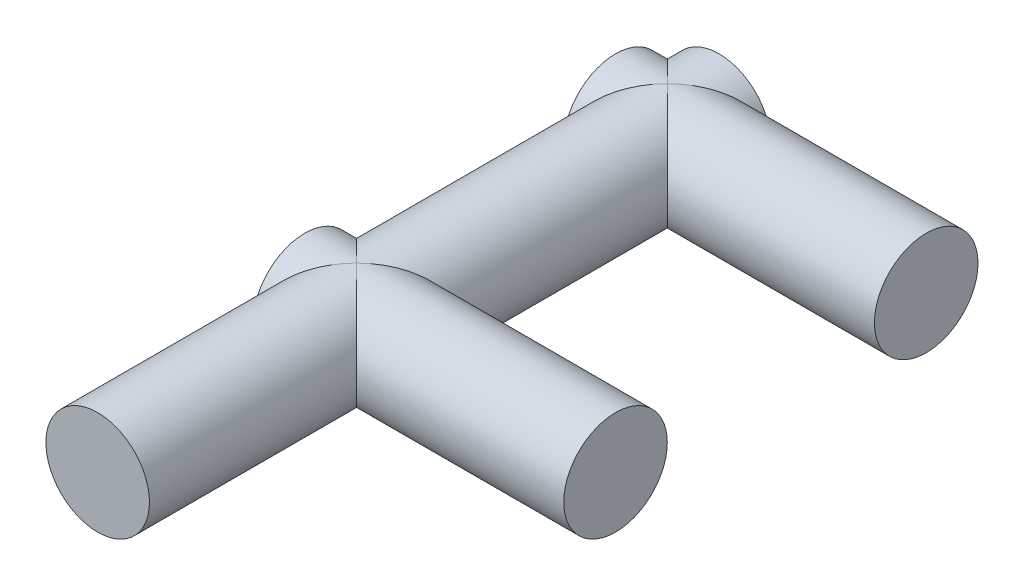
ISO-10303-21;
HEADER;
FILE_DESCRIPTION(('STEP AP214'),'2;1');
FILE_NAME('part.step','',(''),(''),'','','');
FILE_SCHEMA(('AUTOMOTIVE_DESIGN { 1 0 10303 214 1 1 1 1 }'));
ENDSEC;
DATA;
#1=APPLICATION_CONTEXT('core data for automotive mechanical design processes');
#2=APPLICATION_PROTOCOL_DEFINITION('international standard','automotive_design',2000,#1);
#3=PRODUCT_CONTEXT('',#1,'mechanical');
#4=PRODUCT('Part','Part','',(#3));
#5=PRODUCT_RELATED_PRODUCT_CATEGORY('part','',(#4));
#6=PRODUCT_DEFINITION_FORMATION('','',#4);
#7=PRODUCT_DEFINITION_CONTEXT('part definition',#1,'design');
#8=PRODUCT_DEFINITION('design','',#6,#7);
#9=PRODUCT_DEFINITION_SHAPE('','',#8);
#10=(LENGTH_UNIT() NAMED_UNIT(*) SI_UNIT(.MILLI.,.METRE.));
#11=(NAMED_UNIT(*) PLANE_ANGLE_UNIT() SI_UNIT($,.RADIAN.));
#12=(NAMED_UNIT(*) SI_UNIT($,.STERADIAN.) SOLID_ANGLE_UNIT());
#13=UNCERTAINTY_MEASURE_WITH_UNIT(LENGTH_MEASURE(1.E-05),#10,'distance_accuracy_value','');
#14=(GEOMETRIC_REPRESENTATION_CONTEXT(3) GLOBAL_UNCERTAINTY_ASSIGNED_CONTEXT((#13)) GLOBAL_UNIT_ASSIGNED_CONTEXT((#10,
#11,#12)) REPRESENTATION_CONTEXT('',''));
#15=CARTESIAN_POINT('',(0.,0.,0.));
#16=DIRECTION('',(0.,0.,1.));
#17=DIRECTION('',(1.,0.,0.));
#18=AXIS2_PLACEMENT_3D('',#15,#16,#17);
#19=CARTESIAN_POINT('',(0.396875,0.,-1.5875));
#20=DIRECTION('',(0.,0.,1.));
#21=DIRECTION('',(1.,0.,0.));
#22=AXIS2_PLACEMENT_3D('',#19,#20,#21);
#23=CYLINDRICAL_SURFACE('',#22,0.396875);
#24=CARTESIAN_POINT('',(0.396875,0.,1.190625));
#25=DIRECTION('',(-0.707106781186547,0.,-0.707106781186547));
#26=DIRECTION('',(-0.707106781186547,0.,0.707106781186547));
#27=AXIS2_PLACEMENT_3D('',#24,#25,#26);
#28=ELLIPSE('',#27,0.561266007566822,0.396875);
#29=CARTESIAN_POINT('',(0.396875,-0.396875,1.190625));
#30=VERTEX_POINT('',#29);
#31=CARTESIAN_POINT('',(0.396875,0.396875,1.190625));
#32=VERTEX_POINT('',#31);
#33=EDGE_CURVE('E64',#30,#32,#28,.F.);
#34=ORIENTED_EDGE('',*,*,#33,.F.);
#35=CARTESIAN_POINT('',(0.396875,0.,1.190625));
#36=DIRECTION('',(-0.707106781186547,0.,0.707106781186547));
#37=DIRECTION('',(-0.707106781186547,0.,-0.707106781186547));
#38=AXIS2_PLACEMENT_3D('',#35,#36,#37);
#39=ELLIPSE('',#38,0.561266007566822,0.396875);
#40=CARTESIAN_POINT('',(0.,0.,0.79375));
#41=VERTEX_POINT('',#40);
#42=EDGE_CURVE('E129',#41,#30,#39,.T.);
#43=ORIENTED_EDGE('',*,*,#42,.F.);
#44=EDGE_CURVE('E137',#32,#41,#39,.T.);
#45=ORIENTED_EDGE('',*,*,#44,.F.);
#46=EDGE_LOOP('',(#34,#43,#45));
#47=FACE_BOUND('',#46,.T.);
#48=CARTESIAN_POINT('',(0.396875,0.,-1.190625));
#49=DIRECTION('',(-0.707106781186547,0.,0.707106781186547));
#50=DIRECTION('',(0.707106781186547,0.,0.707106781186547));
#51=AXIS2_PLACEMENT_3D('',#48,#49,#50);
#52=ELLIPSE('',#51,0.561266007566822,0.396875);
#53=CARTESIAN_POINT('',(0.396875,-0.396875,-1.190625));
#54=VERTEX_POINT('',#53);
#55=CARTESIAN_POINT('',(0.396875,0.396875,-1.190625));
#56=VERTEX_POINT('',#55);
#57=EDGE_CURVE('E100',#54,#56,#52,.T.);
#58=ORIENTED_EDGE('',*,*,#57,.T.);
#59=CARTESIAN_POINT('',(0.396875,0.,-1.190625));
#60=DIRECTION('',(0.707106781186547,0.,0.707106781186547));
#61=DIRECTION('',(-0.707106781186547,0.,0.707106781186547));
#62=AXIS2_PLACEMENT_3D('',#59,#60,#61);
#63=ELLIPSE('',#62,0.561266007566822,0.396875);
#64=CARTESIAN_POINT('',(0.,0.,-0.79375));
#65=VERTEX_POINT('',#64);
#66=EDGE_CURVE('E11',#56,#65,#63,.T.);
#67=ORIENTED_EDGE('',*,*,#66,.T.);
#68=EDGE_CURVE('E51',#65,#54,#63,.T.);
#69=ORIENTED_EDGE('',*,*,#68,.T.);
#70=EDGE_LOOP('',(#58,#67,#69));
#71=FACE_BOUND('',#70,.T.);
#72=ADVANCED_FACE('F39',(#47,#71),#23,.T.);
#73=CARTESIAN_POINT('',(2.38125,0.,1.190625));
#74=DIRECTION('',(-1.,0.,0.));
#75=DIRECTION('',(0.,0.,1.));
#76=AXIS2_PLACEMENT_3D('',#73,#74,#75);
#77=CYLINDRICAL_SURFACE('',#76,0.396875);
#78=CARTESIAN_POINT('',(0.396875,0.,1.190625));
#79=DIRECTION('',(-0.707106781186547,0.,-0.707106781186547));
#80=DIRECTION('',(-0.707106781186547,0.,0.707106781186547));
#81=AXIS2_PLACEMENT_3D('',#78,#79,#80);
#82=ELLIPSE('',#81,0.561266007566822,0.396875);
#83=CARTESIAN_POINT('',(0.,0.,1.5875));
#84=VERTEX_POINT('',#83);
#85=EDGE_CURVE('E126',#84,#32,#82,.T.);
#86=ORIENTED_EDGE('',*,*,#85,.T.);
#87=ORIENTED_EDGE('',*,*,#44,.T.);
#88=CARTESIAN_POINT('',(0.,0.,1.190625));
#89=DIRECTION('',(1.,0.,0.));
#90=DIRECTION('',(0.,0.,-1.));
#91=AXIS2_PLACEMENT_3D('',#88,#89,#90);
#92=CIRCLE('',#91,0.396875);
#93=EDGE_CURVE('E147',#41,#84,#92,.T.);
#94=ORIENTED_EDGE('',*,*,#93,.T.);
#95=EDGE_LOOP('',(#86,#87,#94));
#96=FACE_BOUND('',#95,.T.);
#97=ADVANCED_FACE('F192',(#96),#77,.T.);
#98=EDGE_CURVE('E150',#84,#41,#92,.T.);
#99=ORIENTED_EDGE('',*,*,#98,.T.);
#100=ORIENTED_EDGE('',*,*,#42,.T.);
#101=EDGE_CURVE('E131',#30,#84,#82,.T.);
#102=ORIENTED_EDGE('',*,*,#101,.T.);
#103=EDGE_LOOP('',(#99,#100,#102));
#104=FACE_BOUND('',#103,.T.);
#105=ADVANCED_FACE('F41',(#104),#77,.T.);
#106=CARTESIAN_POINT('',(0.,0.,1.190625));
#107=DIRECTION('',(1.,0.,0.));
#108=DIRECTION('',(0.,0.,-1.));
#109=AXIS2_PLACEMENT_3D('',#106,#107,#108);
#110=PLANE('',#109);
#111=ORIENTED_EDGE('',*,*,#93,.F.);
#112=ORIENTED_EDGE('',*,*,#98,.F.);
#113=EDGE_LOOP('',(#111,#112));
#114=FACE_BOUND('',#113,.T.);
#115=ADVANCED_FACE('F177',(#114),#110,.F.);
#116=CARTESIAN_POINT('',(0.396875,0.,3.175));
#117=DIRECTION('',(0.,0.,1.));
#118=DIRECTION('',(1.,0.,0.));
#119=AXIS2_PLACEMENT_3D('',#116,#117,#118);
#120=CIRCLE('',#119,0.396875);
#121=CARTESIAN_POINT('',(0.79375,0.,3.175));
#122=VERTEX_POINT('',#121);
#123=EDGE_CURVE('E122',#122,#122,#120,.T.);
#124=ORIENTED_EDGE('',*,*,#123,.F.);
#125=EDGE_LOOP('',(#124));
#126=FACE_BOUND('',#125,.T.);
#127=ORIENTED_EDGE('',*,*,#101,.F.);
#128=CARTESIAN_POINT('',(0.396875,0.,1.190625));
#129=DIRECTION('',(-0.707106781186547,0.,0.707106781186547));
#130=DIRECTION('',(-0.707106781186547,0.,-0.707106781186547));
#131=AXIS2_PLACEMENT_3D('',#128,#129,#130);
#132=ELLIPSE('',#131,0.561266007566822,0.396875);
#133=EDGE_CURVE('E138',#32,#30,#132,.F.);
#134=ORIENTED_EDGE('',*,*,#133,.F.);
#135=ORIENTED_EDGE('',*,*,#85,.F.);
#136=EDGE_LOOP('',(#127,#134,#135));
#137=FACE_BOUND('',#136,.T.);
#138=ADVANCED_FACE('F174',(#126,#137),#23,.T.);
#139=CARTESIAN_POINT('',(0.396875,0.,3.175));
#140=DIRECTION('',(0.,0.,1.));
#141=DIRECTION('',(1.,0.,0.));
#142=AXIS2_PLACEMENT_3D('',#139,#140,#141);
#143=PLANE('',#142);
#144=ORIENTED_EDGE('',*,*,#123,.T.);
#145=EDGE_LOOP('',(#144));
#146=FACE_BOUND('',#145,.T.);
#147=ADVANCED_FACE('F172',(#146),#143,.T.);
#148=CARTESIAN_POINT('',(2.38125,0.,1.190625));
#149=DIRECTION('',(1.,0.,0.));
#150=DIRECTION('',(0.,0.,-1.));
#151=AXIS2_PLACEMENT_3D('',#148,#149,#150);
#152=PLANE('',#151);
#153=CARTESIAN_POINT('',(2.38125,0.,1.190625));
#154=DIRECTION('',(1.,0.,0.));
#155=DIRECTION('',(0.,0.,-1.));
#156=AXIS2_PLACEMENT_3D('',#153,#154,#155);
#157=CIRCLE('',#156,0.396875);
#158=CARTESIAN_POINT('',(2.38125,0.,0.79375));
#159=VERTEX_POINT('',#158);
#160=EDGE_CURVE('E143',#159,#159,#157,.T.);
#161=ORIENTED_EDGE('',*,*,#160,.T.);
#162=EDGE_LOOP('',(#161));
#163=FACE_BOUND('',#162,.T.);
#164=ADVANCED_FACE('F200',(#163),#152,.T.);
#165=ORIENTED_EDGE('',*,*,#160,.F.);
#166=EDGE_LOOP('',(#165));
#167=FACE_BOUND('',#166,.T.);
#168=ORIENTED_EDGE('',*,*,#33,.T.);
#169=ORIENTED_EDGE('',*,*,#133,.T.);
#170=EDGE_LOOP('',(#168,#169));
#171=FACE_BOUND('',#170,.T.);
#172=ADVANCED_FACE('F187',(#167,#171),#77,.T.);
#173=CARTESIAN_POINT('',(2.38125,0.,-1.190625));
#174=DIRECTION('',(1.,0.,0.));
#175=DIRECTION('',(0.,0.,-1.));
#176=AXIS2_PLACEMENT_3D('',#173,#174,#175);
#177=PLANE('',#176);
#178=CARTESIAN_POINT('',(2.38125,0.,-1.190625));
#179=DIRECTION('',(1.,0.,0.));
#180=DIRECTION('',(0.,0.,-1.));
#181=AXIS2_PLACEMENT_3D('',#178,#179,#180);
#182=CIRCLE('',#181,0.396875);
#183=CARTESIAN_POINT('',(2.38125,0.,-1.5875));
#184=VERTEX_POINT('',#183);
#185=EDGE_CURVE('E112',#184,#184,#182,.T.);
#186=ORIENTED_EDGE('',*,*,#185,.T.);
#187=EDGE_LOOP('',(#186));
#188=FACE_BOUND('',#187,.T.);
#189=ADVANCED_FACE('F161',(#188),#177,.T.);
#190=CARTESIAN_POINT('',(2.38125,0.,-1.190625));
#191=DIRECTION('',(-1.,0.,0.));
#192=DIRECTION('',(0.,0.,1.));
#193=AXIS2_PLACEMENT_3D('',#190,#191,#192);
#194=CYLINDRICAL_SURFACE('',#193,0.396875);
#195=ORIENTED_EDGE('',*,*,#57,.F.);
#196=CARTESIAN_POINT('',(0.396875,0.,-1.190625));
#197=DIRECTION('',(0.707106781186547,0.,0.707106781186547));
#198=DIRECTION('',(-0.707106781186547,0.,0.707106781186547));
#199=AXIS2_PLACEMENT_3D('',#196,#197,#198);
#200=ELLIPSE('',#199,0.561266007566822,0.396875);
#201=CARTESIAN_POINT('',(0.79375,0.,-1.5875));
#202=VERTEX_POINT('',#201);
#203=EDGE_CURVE('E43',#202,#54,#200,.F.);
#204=ORIENTED_EDGE('',*,*,#203,.F.);
#205=EDGE_CURVE('E49',#56,#202,#200,.F.);
#206=ORIENTED_EDGE('',*,*,#205,.F.);
#207=EDGE_LOOP('',(#195,#204,#206));
#208=FACE_BOUND('',#207,.T.);
#209=ORIENTED_EDGE('',*,*,#185,.F.);
#210=EDGE_LOOP('',(#209));
#211=FACE_BOUND('',#210,.T.);
#212=ADVANCED_FACE('F156',(#208,#211),#194,.T.);
#213=CARTESIAN_POINT('',(0.396875,0.,-1.190625));
#214=DIRECTION('',(-0.707106781186547,0.,0.707106781186547));
#215=DIRECTION('',(0.707106781186547,0.,0.707106781186547));
#216=AXIS2_PLACEMENT_3D('',#213,#214,#215);
#217=ELLIPSE('',#216,0.561266007566822,0.396875);
#218=CARTESIAN_POINT('',(0.,0.,-1.5875));
#219=VERTEX_POINT('',#218);
#220=EDGE_CURVE('E88',#219,#56,#217,.F.);
#221=ORIENTED_EDGE('',*,*,#220,.F.);
#222=CARTESIAN_POINT('',(0.,0.,-1.190625));
#223=DIRECTION('',(1.,0.,0.));
#224=DIRECTION('',(0.,0.,-1.));
#225=AXIS2_PLACEMENT_3D('',#222,#223,#224);
#226=CIRCLE('',#225,0.396875);
#227=EDGE_CURVE('E92',#219,#65,#226,.T.);
#228=ORIENTED_EDGE('',*,*,#227,.T.);
#229=ORIENTED_EDGE('',*,*,#66,.F.);
#230=EDGE_LOOP('',(#221,#228,#229));
#231=FACE_BOUND('',#230,.T.);
#232=ADVANCED_FACE('F90',(#231),#194,.T.);
#233=CARTESIAN_POINT('',(0.,0.,-1.190625));
#234=DIRECTION('',(1.,0.,0.));
#235=DIRECTION('',(0.,0.,-1.));
#236=AXIS2_PLACEMENT_3D('',#233,#234,#235);
#237=PLANE('',#236);
#238=EDGE_CURVE('E104',#65,#219,#226,.T.);
#239=ORIENTED_EDGE('',*,*,#238,.F.);
#240=ORIENTED_EDGE('',*,*,#227,.F.);
#241=EDGE_LOOP('',(#239,#240));
#242=FACE_BOUND('',#241,.T.);
#243=ADVANCED_FACE('F110',(#242),#237,.F.);
#244=EDGE_CURVE('E99',#54,#219,#217,.F.);
#245=ORIENTED_EDGE('',*,*,#244,.F.);
#246=ORIENTED_EDGE('',*,*,#68,.F.);
#247=ORIENTED_EDGE('',*,*,#238,.T.);
#248=EDGE_LOOP('',(#245,#246,#247));
#249=FACE_BOUND('',#248,.T.);
#250=ADVANCED_FACE('F105',(#249),#194,.T.);
#251=CARTESIAN_POINT('',(0.396875,0.,-1.5875));
#252=DIRECTION('',(0.,0.,1.));
#253=DIRECTION('',(1.,0.,0.));
#254=AXIS2_PLACEMENT_3D('',#251,#252,#253);
#255=PLANE('',#254);
#256=CARTESIAN_POINT('',(0.396875,0.,-1.5875));
#257=DIRECTION('',(0.,0.,1.));
#258=DIRECTION('',(1.,0.,0.));
#259=AXIS2_PLACEMENT_3D('',#256,#257,#258);
#260=CIRCLE('',#259,0.396875);
#261=EDGE_CURVE('E115',#219,#202,#260,.T.);
#262=ORIENTED_EDGE('',*,*,#261,.F.);
#263=EDGE_CURVE('E120',#202,#219,#260,.T.);
#264=ORIENTED_EDGE('',*,*,#263,.F.);
#265=EDGE_LOOP('',(#262,#264));
#266=FACE_BOUND('',#265,.T.);
#267=ADVANCED_FACE('F119',(#266),#255,.F.);
#268=ORIENTED_EDGE('',*,*,#261,.T.);
#269=ORIENTED_EDGE('',*,*,#203,.T.);
#270=ORIENTED_EDGE('',*,*,#244,.T.);
#271=EDGE_LOOP('',(#268,#269,#270));
#272=FACE_BOUND('',#271,.T.);
#273=ADVANCED_FACE('F114',(#272),#23,.T.);
#274=ORIENTED_EDGE('',*,*,#220,.T.);
#275=ORIENTED_EDGE('',*,*,#205,.T.);
#276=ORIENTED_EDGE('',*,*,#263,.T.);
#277=EDGE_LOOP('',(#274,#275,#276));
#278=FACE_BOUND('',#277,.T.);
#279=ADVANCED_FACE('F124',(#278),#23,.T.);
#280=CLOSED_SHELL('',(#72,#97,#105,#115,#138,#147,#164,#172,#189,#212,#232,#243,#250,#267,#273,#279));
#281=MANIFOLD_SOLID_BREP('B2',#280);
#282=ADVANCED_BREP_SHAPE_REPRESENTATION('',(#18,#281),#14);
#283=SHAPE_DEFINITION_REPRESENTATION(#9,#282);
ENDSEC;
END-ISO-10303-21;
